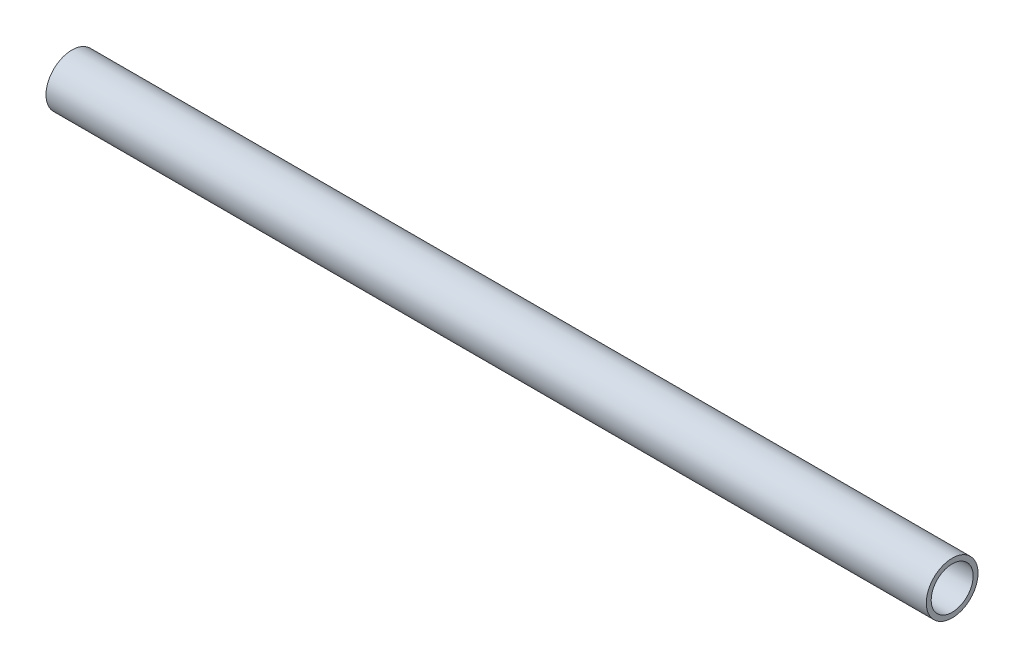
ISO-10303-21;
HEADER;
FILE_DESCRIPTION(('STEP AP214'),'2;1');
FILE_NAME('part.step','',(''),(''),'','','');
FILE_SCHEMA(('AUTOMOTIVE_DESIGN { 1 0 10303 214 1 1 1 1 }'));
ENDSEC;
DATA;
#1=APPLICATION_CONTEXT('core data for automotive mechanical design processes');
#2=APPLICATION_PROTOCOL_DEFINITION('international standard','automotive_design',2000,#1);
#3=PRODUCT_CONTEXT('',#1,'mechanical');
#4=PRODUCT('Part','Part','',(#3));
#5=PRODUCT_RELATED_PRODUCT_CATEGORY('part','',(#4));
#6=PRODUCT_DEFINITION_FORMATION('','',#4);
#7=PRODUCT_DEFINITION_CONTEXT('part definition',#1,'design');
#8=PRODUCT_DEFINITION('design','',#6,#7);
#9=PRODUCT_DEFINITION_SHAPE('','',#8);
#10=(LENGTH_UNIT() NAMED_UNIT(*) SI_UNIT(.MILLI.,.METRE.));
#11=(NAMED_UNIT(*) PLANE_ANGLE_UNIT() SI_UNIT($,.RADIAN.));
#12=(NAMED_UNIT(*) SI_UNIT($,.STERADIAN.) SOLID_ANGLE_UNIT());
#13=UNCERTAINTY_MEASURE_WITH_UNIT(LENGTH_MEASURE(1.E-05),#10,'distance_accuracy_value','');
#14=(GEOMETRIC_REPRESENTATION_CONTEXT(3) GLOBAL_UNCERTAINTY_ASSIGNED_CONTEXT((#13)) GLOBAL_UNIT_ASSIGNED_CONTEXT((#10,
#11,#12)) REPRESENTATION_CONTEXT('',''));
#15=CARTESIAN_POINT('',(0.,0.,0.));
#16=DIRECTION('',(0.,0.,1.));
#17=DIRECTION('',(1.,0.,0.));
#18=AXIS2_PLACEMENT_3D('',#15,#16,#17);
#19=CARTESIAN_POINT('',(-82.843399339934,0.,-5.616501650165));
#20=DIRECTION('',(1.,0.,0.));
#21=DIRECTION('',(0.,0.,-1.));
#22=AXIS2_PLACEMENT_3D('',#19,#20,#21);
#23=CYLINDRICAL_SURFACE('',#22,10.287);
#24=CARTESIAN_POINT('',(-82.843399339934,0.,-5.616501650165));
#25=DIRECTION('',(-1.,0.,0.));
#26=DIRECTION('',(0.,0.,1.));
#27=AXIS2_PLACEMENT_3D('',#24,#25,#26);
#28=CIRCLE('',#27,10.287);
#29=CARTESIAN_POINT('',(-82.843399339934,0.,4.670498349835));
#30=VERTEX_POINT('',#29);
#31=EDGE_CURVE('E51',#30,#30,#28,.T.);
#32=ORIENTED_EDGE('',*,*,#31,.T.);
#33=EDGE_LOOP('',(#32));
#34=FACE_BOUND('',#33,.T.);
#35=CARTESIAN_POINT('',(348.956600660066,0.,-5.616501650165));
#36=DIRECTION('',(-1.,0.,0.));
#37=DIRECTION('',(0.,0.,1.));
#38=AXIS2_PLACEMENT_3D('',#35,#36,#37);
#39=CIRCLE('',#38,10.287);
#40=CARTESIAN_POINT('',(348.956600660066,0.,4.670498349835));
#41=VERTEX_POINT('',#40);
#42=EDGE_CURVE('E57',#41,#41,#39,.T.);
#43=ORIENTED_EDGE('',*,*,#42,.F.);
#44=EDGE_LOOP('',(#43));
#45=FACE_BOUND('',#44,.T.);
#46=ADVANCED_FACE('F44',(#34,#45),#23,.F.);
#47=CARTESIAN_POINT('',(-82.843399339934,0.,-5.616501650165));
#48=DIRECTION('',(1.,0.,0.));
#49=DIRECTION('',(0.,0.,-1.));
#50=AXIS2_PLACEMENT_3D('',#47,#48,#49);
#51=CYLINDRICAL_SURFACE('',#50,12.7);
#52=CARTESIAN_POINT('',(-82.843399339934,0.,-5.616501650165));
#53=DIRECTION('',(-1.,0.,0.));
#54=DIRECTION('',(0.,0.,1.));
#55=AXIS2_PLACEMENT_3D('',#52,#53,#54);
#56=CIRCLE('',#55,12.7);
#57=CARTESIAN_POINT('',(-82.843399339934,0.,7.083498349835));
#58=VERTEX_POINT('',#57);
#59=EDGE_CURVE('E11',#58,#58,#56,.T.);
#60=ORIENTED_EDGE('',*,*,#59,.F.);
#61=EDGE_LOOP('',(#60));
#62=FACE_BOUND('',#61,.T.);
#63=CARTESIAN_POINT('',(348.956600660066,0.,-5.616501650165));
#64=DIRECTION('',(-1.,0.,0.));
#65=DIRECTION('',(0.,0.,1.));
#66=AXIS2_PLACEMENT_3D('',#63,#64,#65);
#67=CIRCLE('',#66,12.7);
#68=CARTESIAN_POINT('',(348.956600660066,0.,7.083498349835));
#69=VERTEX_POINT('',#68);
#70=EDGE_CURVE('E47',#69,#69,#67,.T.);
#71=ORIENTED_EDGE('',*,*,#70,.T.);
#72=EDGE_LOOP('',(#71));
#73=FACE_BOUND('',#72,.T.);
#74=ADVANCED_FACE('F64',(#62,#73),#51,.T.);
#75=CARTESIAN_POINT('',(-82.843399339934,0.,-5.616501650165));
#76=DIRECTION('',(-1.,0.,0.));
#77=DIRECTION('',(0.,0.,1.));
#78=AXIS2_PLACEMENT_3D('',#75,#76,#77);
#79=PLANE('',#78);
#80=ORIENTED_EDGE('',*,*,#31,.F.);
#81=EDGE_LOOP('',(#80));
#82=FACE_BOUND('',#81,.T.);
#83=ORIENTED_EDGE('',*,*,#59,.T.);
#84=EDGE_LOOP('',(#83));
#85=FACE_BOUND('',#84,.T.);
#86=ADVANCED_FACE('F68',(#82,#85),#79,.T.);
#87=CARTESIAN_POINT('',(348.956600660066,0.,-5.616501650165));
#88=DIRECTION('',(-1.,0.,0.));
#89=DIRECTION('',(0.,0.,1.));
#90=AXIS2_PLACEMENT_3D('',#87,#88,#89);
#91=PLANE('',#90);
#92=ORIENTED_EDGE('',*,*,#42,.T.);
#93=EDGE_LOOP('',(#92));
#94=FACE_BOUND('',#93,.T.);
#95=ORIENTED_EDGE('',*,*,#70,.F.);
#96=EDGE_LOOP('',(#95));
#97=FACE_BOUND('',#96,.T.);
#98=ADVANCED_FACE('F66',(#94,#97),#91,.F.);
#99=CLOSED_SHELL('',(#46,#74,#86,#98));
#100=MANIFOLD_SOLID_BREP('B2',#99);
#101=ADVANCED_BREP_SHAPE_REPRESENTATION('',(#18,#100),#14);
#102=SHAPE_DEFINITION_REPRESENTATION(#9,#101);
ENDSEC;
END-ISO-10303-21;
